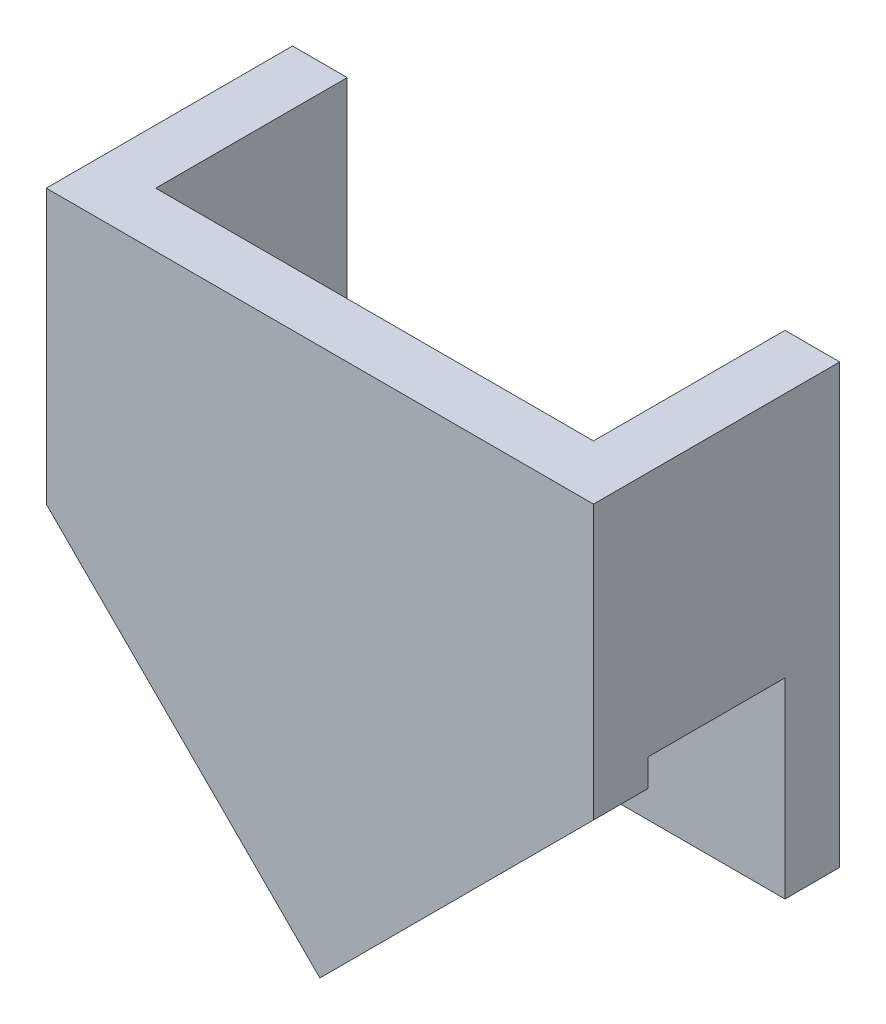
ISO-10303-21;
HEADER;
FILE_DESCRIPTION(('STEP AP214'),'2;1');
FILE_NAME('part.step','',(''),(''),'','','');
FILE_SCHEMA(('AUTOMOTIVE_DESIGN { 1 0 10303 214 1 1 1 1 }'));
ENDSEC;
DATA;
#1=APPLICATION_CONTEXT('core data for automotive mechanical design processes');
#2=APPLICATION_PROTOCOL_DEFINITION('international standard','automotive_design',2000,#1);
#3=PRODUCT_CONTEXT('',#1,'mechanical');
#4=PRODUCT('Part','Part','',(#3));
#5=PRODUCT_RELATED_PRODUCT_CATEGORY('part','',(#4));
#6=PRODUCT_DEFINITION_FORMATION('','',#4);
#7=PRODUCT_DEFINITION_CONTEXT('part definition',#1,'design');
#8=PRODUCT_DEFINITION('design','',#6,#7);
#9=PRODUCT_DEFINITION_SHAPE('','',#8);
#10=(LENGTH_UNIT() NAMED_UNIT(*) SI_UNIT(.MILLI.,.METRE.));
#11=(NAMED_UNIT(*) PLANE_ANGLE_UNIT() SI_UNIT($,.RADIAN.));
#12=(NAMED_UNIT(*) SI_UNIT($,.STERADIAN.) SOLID_ANGLE_UNIT());
#13=UNCERTAINTY_MEASURE_WITH_UNIT(LENGTH_MEASURE(1.E-05),#10,'distance_accuracy_value','');
#14=(GEOMETRIC_REPRESENTATION_CONTEXT(3) GLOBAL_UNCERTAINTY_ASSIGNED_CONTEXT((#13)) GLOBAL_UNIT_ASSIGNED_CONTEXT((#10,
#11,#12)) REPRESENTATION_CONTEXT('',''));
#15=CARTESIAN_POINT('',(0.,0.,0.));
#16=DIRECTION('',(0.,0.,1.));
#17=DIRECTION('',(1.,0.,0.));
#18=AXIS2_PLACEMENT_3D('',#15,#16,#17);
#19=CARTESIAN_POINT('',(40.,100.,12.5));
#20=DIRECTION('',(0.,0.,1.));
#21=DIRECTION('',(1.,0.,0.));
#22=AXIS2_PLACEMENT_3D('',#19,#20,#21);
#23=PLANE('',#22);
#24=DIRECTION('',(0.,-1.,0.));
#25=VECTOR('',#24,1.);
#26=CARTESIAN_POINT('',(40.,100.,12.5));
#27=LINE('',#26,#25);
#28=CARTESIAN_POINT('',(40.,100.,12.5));
#29=VERTEX_POINT('',#28);
#30=CARTESIAN_POINT('',(40.,65.,12.5));
#31=VERTEX_POINT('',#30);
#32=EDGE_CURVE('E277',#29,#31,#27,.T.);
#33=ORIENTED_EDGE('',*,*,#32,.T.);
#34=DIRECTION('',(1.,0.,0.));
#35=VECTOR('',#34,1.);
#36=CARTESIAN_POINT('',(-50.,65.,12.5));
#37=LINE('',#36,#35);
#38=CARTESIAN_POINT('',(-40.,65.,12.5));
#39=VERTEX_POINT('',#38);
#40=EDGE_CURVE('E220',#39,#31,#37,.T.);
#41=ORIENTED_EDGE('',*,*,#40,.F.);
#42=DIRECTION('',(0.,-1.,0.));
#43=VECTOR('',#42,1.);
#44=CARTESIAN_POINT('',(-40.,100.,12.5));
#45=LINE('',#44,#43);
#46=CARTESIAN_POINT('',(-40.,100.,12.5));
#47=VERTEX_POINT('',#46);
#48=EDGE_CURVE('E274',#47,#39,#45,.T.);
#49=ORIENTED_EDGE('',*,*,#48,.F.);
#50=DIRECTION('',(-1.,0.,0.));
#51=VECTOR('',#50,1.);
#52=CARTESIAN_POINT('',(40.,100.,12.5));
#53=LINE('',#52,#51);
#54=EDGE_CURVE('E268',#29,#47,#53,.T.);
#55=ORIENTED_EDGE('',*,*,#54,.F.);
#56=EDGE_LOOP('',(#33,#41,#49,#55));
#57=FACE_BOUND('',#56,.T.);
#58=ADVANCED_FACE('F38',(#57),#23,.F.);
#59=CARTESIAN_POINT('',(-50.,100.,22.5));
#60=DIRECTION('',(1.,0.,0.));
#61=DIRECTION('',(0.,0.,-1.));
#62=AXIS2_PLACEMENT_3D('',#59,#60,#61);
#63=PLANE('',#62);
#64=DIRECTION('',(0.,-1.,0.));
#65=VECTOR('',#64,1.);
#66=CARTESIAN_POINT('',(-50.,100.,22.5));
#67=LINE('',#66,#65);
#68=CARTESIAN_POINT('',(-50.,100.,22.5));
#69=VERTEX_POINT('',#68);
#70=CARTESIAN_POINT('',(-50.,50.,22.5));
#71=VERTEX_POINT('',#70);
#72=EDGE_CURVE('E289',#69,#71,#67,.T.);
#73=ORIENTED_EDGE('',*,*,#72,.F.);
#74=DIRECTION('',(0.,0.,1.));
#75=VECTOR('',#74,1.);
#76=CARTESIAN_POINT('',(-50.,100.,22.5));
#77=LINE('',#76,#75);
#78=CARTESIAN_POINT('',(-50.,100.,-22.5));
#79=VERTEX_POINT('',#78);
#80=EDGE_CURVE('E258',#79,#69,#77,.T.);
#81=ORIENTED_EDGE('',*,*,#80,.F.);
#82=DIRECTION('',(0.,-1.,0.));
#83=VECTOR('',#82,1.);
#84=CARTESIAN_POINT('',(-50.,100.,-22.5));
#85=LINE('',#84,#83);
#86=CARTESIAN_POINT('',(-50.,20.,-22.5000000000001));
#87=VERTEX_POINT('',#86);
#88=EDGE_CURVE('E46',#79,#87,#85,.T.);
#89=ORIENTED_EDGE('',*,*,#88,.T.);
#90=DIRECTION('',(0.,0.,-1.));
#91=VECTOR('',#90,1.);
#92=CARTESIAN_POINT('',(-50.,20.,-12.5000000000001));
#93=LINE('',#92,#91);
#94=CARTESIAN_POINT('',(-50.,20.,-12.5000000000001));
#95=VERTEX_POINT('',#94);
#96=EDGE_CURVE('E229',#95,#87,#93,.T.);
#97=ORIENTED_EDGE('',*,*,#96,.F.);
#98=DIRECTION('',(0.,1.,0.));
#99=VECTOR('',#98,1.);
#100=CARTESIAN_POINT('',(-50.,100.,-12.5));
#101=LINE('',#100,#99);
#102=CARTESIAN_POINT('',(-50.,55.,-12.5));
#103=VERTEX_POINT('',#102);
#104=EDGE_CURVE('E254',#95,#103,#101,.T.);
#105=ORIENTED_EDGE('',*,*,#104,.T.);
#106=DIRECTION('',(0.,0.,-1.));
#107=VECTOR('',#106,1.);
#108=CARTESIAN_POINT('',(-50.,55.,12.5));
#109=LINE('',#108,#107);
#110=CARTESIAN_POINT('',(-50.,55.,12.5));
#111=VERTEX_POINT('',#110);
#112=EDGE_CURVE('E204',#111,#103,#109,.T.);
#113=ORIENTED_EDGE('',*,*,#112,.F.);
#114=DIRECTION('',(0.,-1.,0.));
#115=VECTOR('',#114,1.);
#116=CARTESIAN_POINT('',(-50.,100.,12.5));
#117=LINE('',#116,#115);
#118=CARTESIAN_POINT('',(-50.,50.,12.5));
#119=VERTEX_POINT('',#118);
#120=EDGE_CURVE('E177',#111,#119,#117,.T.);
#121=ORIENTED_EDGE('',*,*,#120,.T.);
#122=DIRECTION('',(0.,0.,1.));
#123=VECTOR('',#122,1.);
#124=CARTESIAN_POINT('',(-50.,50.,12.5));
#125=LINE('',#124,#123);
#126=EDGE_CURVE('E248',#119,#71,#125,.T.);
#127=ORIENTED_EDGE('',*,*,#126,.T.);
#128=EDGE_LOOP('',(#73,#81,#89,#97,#105,#113,#121,#127));
#129=FACE_BOUND('',#128,.T.);
#130=ADVANCED_FACE('F40',(#129),#63,.F.);
#131=CARTESIAN_POINT('',(50.,100.,22.5));
#132=DIRECTION('',(0.,0.,-1.));
#133=DIRECTION('',(-1.,0.,0.));
#134=AXIS2_PLACEMENT_3D('',#131,#132,#133);
#135=PLANE('',#134);
#136=DIRECTION('',(-0.707106781186547,0.707106781186547,0.));
#137=VECTOR('',#136,1.);
#138=CARTESIAN_POINT('',(-50.,50.,22.5));
#139=LINE('',#138,#137);
#140=CARTESIAN_POINT('',(0.,0.,22.5));
#141=VERTEX_POINT('',#140);
#142=EDGE_CURVE('E242',#141,#71,#139,.T.);
#143=ORIENTED_EDGE('',*,*,#142,.F.);
#144=DIRECTION('',(-0.707106781186547,-0.707106781186548,0.));
#145=VECTOR('',#144,1.);
#146=CARTESIAN_POINT('',(0.,0.,22.5));
#147=LINE('',#146,#145);
#148=CARTESIAN_POINT('',(50.,50.,22.5));
#149=VERTEX_POINT('',#148);
#150=EDGE_CURVE('E233',#149,#141,#147,.T.);
#151=ORIENTED_EDGE('',*,*,#150,.F.);
#152=DIRECTION('',(0.,-1.,0.));
#153=VECTOR('',#152,1.);
#154=CARTESIAN_POINT('',(50.,100.,22.5));
#155=LINE('',#154,#153);
#156=CARTESIAN_POINT('',(50.,100.,22.5));
#157=VERTEX_POINT('',#156);
#158=EDGE_CURVE('E286',#157,#149,#155,.T.);
#159=ORIENTED_EDGE('',*,*,#158,.F.);
#160=DIRECTION('',(1.,0.,0.));
#161=VECTOR('',#160,1.);
#162=CARTESIAN_POINT('',(50.,100.,22.5));
#163=LINE('',#162,#161);
#164=EDGE_CURVE('E260',#69,#157,#163,.T.);
#165=ORIENTED_EDGE('',*,*,#164,.F.);
#166=ORIENTED_EDGE('',*,*,#72,.T.);
#167=EDGE_LOOP('',(#143,#151,#159,#165,#166));
#168=FACE_BOUND('',#167,.T.);
#169=ADVANCED_FACE('F316',(#168),#135,.F.);
#170=CARTESIAN_POINT('',(50.,100.,22.5));
#171=DIRECTION('',(-1.,0.,0.));
#172=DIRECTION('',(0.,0.,1.));
#173=AXIS2_PLACEMENT_3D('',#170,#171,#172);
#174=PLANE('',#173);
#175=DIRECTION('',(0.,0.,1.));
#176=VECTOR('',#175,1.);
#177=CARTESIAN_POINT('',(50.,50.,12.5));
#178=LINE('',#177,#176);
#179=CARTESIAN_POINT('',(50.,50.,12.5));
#180=VERTEX_POINT('',#179);
#181=EDGE_CURVE('E239',#180,#149,#178,.T.);
#182=ORIENTED_EDGE('',*,*,#181,.F.);
#183=DIRECTION('',(0.,1.,0.));
#184=VECTOR('',#183,1.);
#185=CARTESIAN_POINT('',(50.,100.,12.5));
#186=LINE('',#185,#184);
#187=CARTESIAN_POINT('',(50.,55.,12.5));
#188=VERTEX_POINT('',#187);
#189=EDGE_CURVE('E214',#180,#188,#186,.T.);
#190=ORIENTED_EDGE('',*,*,#189,.T.);
#191=DIRECTION('',(0.,0.,-1.));
#192=VECTOR('',#191,1.);
#193=CARTESIAN_POINT('',(50.,55.,12.5));
#194=LINE('',#193,#192);
#195=CARTESIAN_POINT('',(50.,55.,-12.5));
#196=VERTEX_POINT('',#195);
#197=EDGE_CURVE('E207',#188,#196,#194,.T.);
#198=ORIENTED_EDGE('',*,*,#197,.T.);
#199=DIRECTION('',(0.,-1.,0.));
#200=VECTOR('',#199,1.);
#201=CARTESIAN_POINT('',(50.,100.,-12.5));
#202=LINE('',#201,#200);
#203=CARTESIAN_POINT('',(50.,20.,-12.5));
#204=VERTEX_POINT('',#203);
#205=EDGE_CURVE('E53',#196,#204,#202,.T.);
#206=ORIENTED_EDGE('',*,*,#205,.T.);
#207=DIRECTION('',(0.,0.,-1.));
#208=VECTOR('',#207,1.);
#209=CARTESIAN_POINT('',(50.,20.,-12.5));
#210=LINE('',#209,#208);
#211=CARTESIAN_POINT('',(50.,20.,-22.5));
#212=VERTEX_POINT('',#211);
#213=EDGE_CURVE('E231',#204,#212,#210,.T.);
#214=ORIENTED_EDGE('',*,*,#213,.T.);
#215=DIRECTION('',(0.,-1.,0.));
#216=VECTOR('',#215,1.);
#217=CARTESIAN_POINT('',(50.,100.,-22.5));
#218=LINE('',#217,#216);
#219=CARTESIAN_POINT('',(50.,100.,-22.5));
#220=VERTEX_POINT('',#219);
#221=EDGE_CURVE('E283',#220,#212,#218,.T.);
#222=ORIENTED_EDGE('',*,*,#221,.F.);
#223=DIRECTION('',(0.,0.,-1.));
#224=VECTOR('',#223,1.);
#225=CARTESIAN_POINT('',(50.,100.,22.5));
#226=LINE('',#225,#224);
#227=EDGE_CURVE('E262',#157,#220,#226,.T.);
#228=ORIENTED_EDGE('',*,*,#227,.F.);
#229=ORIENTED_EDGE('',*,*,#158,.T.);
#230=EDGE_LOOP('',(#182,#190,#198,#206,#214,#222,#228,#229));
#231=FACE_BOUND('',#230,.T.);
#232=ADVANCED_FACE('F323',(#231),#174,.F.);
#233=CARTESIAN_POINT('',(50.,100.,-22.5));
#234=DIRECTION('',(0.,0.,1.));
#235=DIRECTION('',(1.,0.,0.));
#236=AXIS2_PLACEMENT_3D('',#233,#234,#235);
#237=PLANE('',#236);
#238=ORIENTED_EDGE('',*,*,#221,.T.);
#239=DIRECTION('',(1.,0.,0.));
#240=VECTOR('',#239,1.);
#241=CARTESIAN_POINT('',(-50.,20.,-22.5000000000001));
#242=LINE('',#241,#240);
#243=EDGE_CURVE('E225',#87,#212,#242,.T.);
#244=ORIENTED_EDGE('',*,*,#243,.F.);
#245=ORIENTED_EDGE('',*,*,#88,.F.);
#246=DIRECTION('',(-1.,0.,0.));
#247=VECTOR('',#246,1.);
#248=CARTESIAN_POINT('',(-40.,100.,-22.5));
#249=LINE('',#248,#247);
#250=CARTESIAN_POINT('',(-40.,100.,-22.5));
#251=VERTEX_POINT('',#250);
#252=EDGE_CURVE('E256',#251,#79,#249,.T.);
#253=ORIENTED_EDGE('',*,*,#252,.F.);
#254=DIRECTION('',(0.,-1.,0.));
#255=VECTOR('',#254,1.);
#256=CARTESIAN_POINT('',(-40.,100.,-22.5));
#257=LINE('',#256,#255);
#258=CARTESIAN_POINT('',(-40.,65.,-22.5000000000001));
#259=VERTEX_POINT('',#258);
#260=EDGE_CURVE('E271',#251,#259,#257,.T.);
#261=ORIENTED_EDGE('',*,*,#260,.T.);
#262=DIRECTION('',(1.,0.,0.));
#263=VECTOR('',#262,1.);
#264=CARTESIAN_POINT('',(40.,65.,-22.5));
#265=LINE('',#264,#263);
#266=CARTESIAN_POINT('',(40.,65.,-22.5));
#267=VERTEX_POINT('',#266);
#268=EDGE_CURVE('E217',#259,#267,#265,.T.);
#269=ORIENTED_EDGE('',*,*,#268,.T.);
#270=DIRECTION('',(0.,-1.,0.));
#271=VECTOR('',#270,1.);
#272=CARTESIAN_POINT('',(40.,100.,-22.5));
#273=LINE('',#272,#271);
#274=CARTESIAN_POINT('',(40.,100.,-22.5));
#275=VERTEX_POINT('',#274);
#276=EDGE_CURVE('E280',#275,#267,#273,.T.);
#277=ORIENTED_EDGE('',*,*,#276,.F.);
#278=DIRECTION('',(-1.,0.,0.));
#279=VECTOR('',#278,1.);
#280=CARTESIAN_POINT('',(50.,100.,-22.5));
#281=LINE('',#280,#279);
#282=EDGE_CURVE('E264',#220,#275,#281,.T.);
#283=ORIENTED_EDGE('',*,*,#282,.F.);
#284=EDGE_LOOP('',(#238,#244,#245,#253,#261,#269,#277,#283));
#285=FACE_BOUND('',#284,.T.);
#286=ADVANCED_FACE('F298',(#285),#237,.F.);
#287=CARTESIAN_POINT('',(40.,100.,-22.5));
#288=DIRECTION('',(1.,0.,0.));
#289=DIRECTION('',(0.,0.,-1.));
#290=AXIS2_PLACEMENT_3D('',#287,#288,#289);
#291=PLANE('',#290);
#292=ORIENTED_EDGE('',*,*,#32,.F.);
#293=DIRECTION('',(0.,0.,1.));
#294=VECTOR('',#293,1.);
#295=CARTESIAN_POINT('',(40.,100.,-22.5));
#296=LINE('',#295,#294);
#297=EDGE_CURVE('E266',#275,#29,#296,.T.);
#298=ORIENTED_EDGE('',*,*,#297,.F.);
#299=ORIENTED_EDGE('',*,*,#276,.T.);
#300=DIRECTION('',(0.,0.,1.));
#301=VECTOR('',#300,1.);
#302=CARTESIAN_POINT('',(40.,65.,-22.5));
#303=LINE('',#302,#301);
#304=EDGE_CURVE('E223',#267,#31,#303,.T.);
#305=ORIENTED_EDGE('',*,*,#304,.T.);
#306=EDGE_LOOP('',(#292,#298,#299,#305));
#307=FACE_BOUND('',#306,.T.);
#308=ADVANCED_FACE('F328',(#307),#291,.F.);
#309=DIRECTION('',(-0.707106781186547,0.707106781186547,0.));
#310=VECTOR('',#309,1.);
#311=CARTESIAN_POINT('',(-50.,50.,12.5));
#312=LINE('',#311,#310);
#313=CARTESIAN_POINT('',(0.,0.,12.5));
#314=VERTEX_POINT('',#313);
#315=EDGE_CURVE('E243',#314,#119,#312,.T.);
#316=ORIENTED_EDGE('',*,*,#315,.T.);
#317=ORIENTED_EDGE('',*,*,#120,.F.);
#318=DIRECTION('',(1.,0.,0.));
#319=VECTOR('',#318,1.);
#320=CARTESIAN_POINT('',(-46.1602540378444,55.,12.5));
#321=LINE('',#320,#319);
#322=CARTESIAN_POINT('',(-46.1602540378444,55.,12.5));
#323=VERTEX_POINT('',#322);
#324=EDGE_CURVE('E200',#111,#323,#321,.T.);
#325=ORIENTED_EDGE('',*,*,#324,.T.);
#326=CARTESIAN_POINT('',(-37.5,60.,12.5));
#327=DIRECTION('',(0.,0.,1.));
#328=DIRECTION('',(1.,0.,0.));
#329=AXIS2_PLACEMENT_3D('',#326,#327,#328);
#330=CIRCLE('',#329,10.);
#331=CARTESIAN_POINT('',(-28.8397459621556,55.,12.5));
#332=VERTEX_POINT('',#331);
#333=EDGE_CURVE('E193',#323,#332,#330,.T.);
#334=ORIENTED_EDGE('',*,*,#333,.T.);
#335=DIRECTION('',(1.,0.,0.));
#336=VECTOR('',#335,1.);
#337=CARTESIAN_POINT('',(28.8397459621556,55.,12.5));
#338=LINE('',#337,#336);
#339=CARTESIAN_POINT('',(28.8397459621556,55.,12.5));
#340=VERTEX_POINT('',#339);
#341=EDGE_CURVE('E176',#332,#340,#338,.T.);
#342=ORIENTED_EDGE('',*,*,#341,.T.);
#343=CARTESIAN_POINT('',(37.5,60.,12.5));
#344=DIRECTION('',(0.,0.,1.));
#345=DIRECTION('',(1.,0.,0.));
#346=AXIS2_PLACEMENT_3D('',#343,#344,#345);
#347=CIRCLE('',#346,10.);
#348=CARTESIAN_POINT('',(46.1602540378444,55.,12.5));
#349=VERTEX_POINT('',#348);
#350=EDGE_CURVE('E196',#340,#349,#347,.T.);
#351=ORIENTED_EDGE('',*,*,#350,.T.);
#352=DIRECTION('',(1.,0.,0.));
#353=VECTOR('',#352,1.);
#354=CARTESIAN_POINT('',(50.,55.,12.5));
#355=LINE('',#354,#353);
#356=EDGE_CURVE('E198',#349,#188,#355,.T.);
#357=ORIENTED_EDGE('',*,*,#356,.T.);
#358=ORIENTED_EDGE('',*,*,#189,.F.);
#359=DIRECTION('',(-0.707106781186547,-0.707106781186548,0.));
#360=VECTOR('',#359,1.);
#361=CARTESIAN_POINT('',(0.,0.,12.5));
#362=LINE('',#361,#360);
#363=EDGE_CURVE('E236',#180,#314,#362,.T.);
#364=ORIENTED_EDGE('',*,*,#363,.T.);
#365=EDGE_LOOP('',(#316,#317,#325,#334,#342,#351,#357,#358,#364));
#366=FACE_BOUND('',#365,.T.);
#367=ADVANCED_FACE('F308',(#366),#23,.F.);
#368=CARTESIAN_POINT('',(-40.,100.,-22.5));
#369=DIRECTION('',(-1.,0.,0.));
#370=DIRECTION('',(0.,0.,1.));
#371=AXIS2_PLACEMENT_3D('',#368,#369,#370);
#372=PLANE('',#371);
#373=DIRECTION('',(0.,0.,-1.));
#374=VECTOR('',#373,1.);
#375=CARTESIAN_POINT('',(-40.,65.,-22.5));
#376=LINE('',#375,#374);
#377=EDGE_CURVE('E12',#39,#259,#376,.T.);
#378=ORIENTED_EDGE('',*,*,#377,.T.);
#379=ORIENTED_EDGE('',*,*,#260,.F.);
#380=DIRECTION('',(0.,0.,-1.));
#381=VECTOR('',#380,1.);
#382=CARTESIAN_POINT('',(-40.,100.,-22.5));
#383=LINE('',#382,#381);
#384=EDGE_CURVE('E61',#47,#251,#383,.T.);
#385=ORIENTED_EDGE('',*,*,#384,.F.);
#386=ORIENTED_EDGE('',*,*,#48,.T.);
#387=EDGE_LOOP('',(#378,#379,#385,#386));
#388=FACE_BOUND('',#387,.T.);
#389=ADVANCED_FACE('F334',(#388),#372,.F.);
#390=CARTESIAN_POINT('',(0.,100.,0.));
#391=DIRECTION('',(0.,-1.,0.));
#392=DIRECTION('',(0.,0.,-1.));
#393=AXIS2_PLACEMENT_3D('',#390,#391,#392);
#394=PLANE('',#393);
#395=ORIENTED_EDGE('',*,*,#227,.T.);
#396=ORIENTED_EDGE('',*,*,#282,.T.);
#397=ORIENTED_EDGE('',*,*,#297,.T.);
#398=ORIENTED_EDGE('',*,*,#54,.T.);
#399=ORIENTED_EDGE('',*,*,#384,.T.);
#400=ORIENTED_EDGE('',*,*,#252,.T.);
#401=ORIENTED_EDGE('',*,*,#80,.T.);
#402=ORIENTED_EDGE('',*,*,#164,.T.);
#403=EDGE_LOOP('',(#395,#396,#397,#398,#399,#400,#401,#402));
#404=FACE_BOUND('',#403,.T.);
#405=ADVANCED_FACE('F320',(#404),#394,.F.);
#406=CARTESIAN_POINT('',(100.,55.,-12.5));
#407=DIRECTION('',(0.,0.,-1.));
#408=DIRECTION('',(0.,1.,0.));
#409=AXIS2_PLACEMENT_3D('',#406,#407,#408);
#410=PLANE('',#409);
#411=ORIENTED_EDGE('',*,*,#104,.F.);
#412=DIRECTION('',(1.,0.,0.));
#413=VECTOR('',#412,1.);
#414=CARTESIAN_POINT('',(-50.,20.,-12.5000000000001));
#415=LINE('',#414,#413);
#416=EDGE_CURVE('E226',#95,#204,#415,.T.);
#417=ORIENTED_EDGE('',*,*,#416,.T.);
#418=ORIENTED_EDGE('',*,*,#205,.F.);
#419=DIRECTION('',(1.,0.,0.));
#420=VECTOR('',#419,1.);
#421=CARTESIAN_POINT('',(50.,55.,-12.5));
#422=LINE('',#421,#420);
#423=CARTESIAN_POINT('',(46.1602540378444,55.,-12.5));
#424=VERTEX_POINT('',#423);
#425=EDGE_CURVE('E186',#424,#196,#422,.T.);
#426=ORIENTED_EDGE('',*,*,#425,.F.);
#427=CARTESIAN_POINT('',(37.5,60.,-12.5));
#428=DIRECTION('',(0.,0.,1.));
#429=DIRECTION('',(1.,0.,0.));
#430=AXIS2_PLACEMENT_3D('',#427,#428,#429);
#431=CIRCLE('',#430,10.);
#432=CARTESIAN_POINT('',(28.8397459621556,55.,-12.5));
#433=VERTEX_POINT('',#432);
#434=EDGE_CURVE('E183',#433,#424,#431,.T.);
#435=ORIENTED_EDGE('',*,*,#434,.F.);
#436=DIRECTION('',(1.,0.,0.));
#437=VECTOR('',#436,1.);
#438=CARTESIAN_POINT('',(28.8397459621556,55.,-12.5));
#439=LINE('',#438,#437);
#440=CARTESIAN_POINT('',(-28.8397459621556,55.,-12.5));
#441=VERTEX_POINT('',#440);
#442=EDGE_CURVE('E169',#441,#433,#439,.T.);
#443=ORIENTED_EDGE('',*,*,#442,.F.);
#444=CARTESIAN_POINT('',(-37.5,60.,-12.5));
#445=DIRECTION('',(0.,0.,1.));
#446=DIRECTION('',(1.,0.,0.));
#447=AXIS2_PLACEMENT_3D('',#444,#445,#446);
#448=CIRCLE('',#447,10.);
#449=CARTESIAN_POINT('',(-46.1602540378444,55.,-12.5));
#450=VERTEX_POINT('',#449);
#451=EDGE_CURVE('E158',#450,#441,#448,.T.);
#452=ORIENTED_EDGE('',*,*,#451,.F.);
#453=DIRECTION('',(1.,0.,0.));
#454=VECTOR('',#453,1.);
#455=CARTESIAN_POINT('',(-46.1602540378444,55.,-12.5));
#456=LINE('',#455,#454);
#457=EDGE_CURVE('E191',#103,#450,#456,.T.);
#458=ORIENTED_EDGE('',*,*,#457,.F.);
#459=EDGE_LOOP('',(#411,#417,#418,#426,#435,#443,#452,#458));
#460=FACE_BOUND('',#459,.T.);
#461=ADVANCED_FACE('F181',(#460),#410,.F.);
#462=CARTESIAN_POINT('',(-50.,50.,12.5));
#463=DIRECTION('',(0.707106781186548,0.707106781186548,0.));
#464=DIRECTION('',(-0.707106781186548,0.707106781186548,0.));
#465=AXIS2_PLACEMENT_3D('',#462,#463,#464);
#466=PLANE('',#465);
#467=ORIENTED_EDGE('',*,*,#142,.T.);
#468=ORIENTED_EDGE('',*,*,#126,.F.);
#469=ORIENTED_EDGE('',*,*,#315,.F.);
#470=DIRECTION('',(0.,0.,1.));
#471=VECTOR('',#470,1.);
#472=CARTESIAN_POINT('',(0.,0.,12.5));
#473=LINE('',#472,#471);
#474=EDGE_CURVE('E246',#314,#141,#473,.T.);
#475=ORIENTED_EDGE('',*,*,#474,.T.);
#476=EDGE_LOOP('',(#467,#468,#469,#475));
#477=FACE_BOUND('',#476,.T.);
#478=ADVANCED_FACE('F312',(#477),#466,.F.);
#479=CARTESIAN_POINT('',(0.,0.,12.5));
#480=DIRECTION('',(-0.707106781186548,0.707106781186547,0.));
#481=DIRECTION('',(-0.707106781186547,-0.707106781186548,0.));
#482=AXIS2_PLACEMENT_3D('',#479,#480,#481);
#483=PLANE('',#482);
#484=ORIENTED_EDGE('',*,*,#150,.T.);
#485=ORIENTED_EDGE('',*,*,#474,.F.);
#486=ORIENTED_EDGE('',*,*,#363,.F.);
#487=ORIENTED_EDGE('',*,*,#181,.T.);
#488=EDGE_LOOP('',(#484,#485,#486,#487));
#489=FACE_BOUND('',#488,.T.);
#490=ADVANCED_FACE('F345',(#489),#483,.F.);
#491=CARTESIAN_POINT('',(-50.,20.,-12.5000000000001));
#492=DIRECTION('',(0.,1.,0.));
#493=DIRECTION('',(-1.,0.,0.));
#494=AXIS2_PLACEMENT_3D('',#491,#492,#493);
#495=PLANE('',#494);
#496=ORIENTED_EDGE('',*,*,#243,.T.);
#497=ORIENTED_EDGE('',*,*,#213,.F.);
#498=ORIENTED_EDGE('',*,*,#416,.F.);
#499=ORIENTED_EDGE('',*,*,#96,.T.);
#500=EDGE_LOOP('',(#496,#497,#498,#499));
#501=FACE_BOUND('',#500,.T.);
#502=ADVANCED_FACE('F302',(#501),#495,.F.);
#503=CARTESIAN_POINT('',(-50.,65.,12.5));
#504=DIRECTION('',(0.,1.,0.));
#505=DIRECTION('',(0.,0.,1.));
#506=AXIS2_PLACEMENT_3D('',#503,#504,#505);
#507=PLANE('',#506);
#508=ORIENTED_EDGE('',*,*,#40,.T.);
#509=ORIENTED_EDGE('',*,*,#304,.F.);
#510=ORIENTED_EDGE('',*,*,#268,.F.);
#511=ORIENTED_EDGE('',*,*,#377,.F.);
#512=EDGE_LOOP('',(#508,#509,#510,#511));
#513=FACE_BOUND('',#512,.T.);
#514=ADVANCED_FACE('F336',(#513),#507,.T.);
#515=CARTESIAN_POINT('',(-37.5,60.,12.5));
#516=DIRECTION('',(0.,0.,-1.));
#517=DIRECTION('',(-1.,0.,0.));
#518=AXIS2_PLACEMENT_3D('',#515,#516,#517);
#519=CYLINDRICAL_SURFACE('',#518,10.);
#520=ORIENTED_EDGE('',*,*,#451,.T.);
#521=DIRECTION('',(0.,0.,-1.));
#522=VECTOR('',#521,1.);
#523=CARTESIAN_POINT('',(-28.8397459621556,55.,12.5));
#524=LINE('',#523,#522);
#525=EDGE_CURVE('E161',#332,#441,#524,.T.);
#526=ORIENTED_EDGE('',*,*,#525,.F.);
#527=ORIENTED_EDGE('',*,*,#333,.F.);
#528=DIRECTION('',(0.,0.,-1.));
#529=VECTOR('',#528,1.);
#530=CARTESIAN_POINT('',(-46.1602540378444,55.,12.5));
#531=LINE('',#530,#529);
#532=EDGE_CURVE('E164',#323,#450,#531,.T.);
#533=ORIENTED_EDGE('',*,*,#532,.T.);
#534=EDGE_LOOP('',(#520,#526,#527,#533));
#535=FACE_BOUND('',#534,.T.);
#536=ADVANCED_FACE('F160',(#535),#519,.T.);
#537=CARTESIAN_POINT('',(37.5,60.,12.5));
#538=DIRECTION('',(0.,0.,-1.));
#539=DIRECTION('',(-1.,0.,0.));
#540=AXIS2_PLACEMENT_3D('',#537,#538,#539);
#541=CYLINDRICAL_SURFACE('',#540,10.);
#542=ORIENTED_EDGE('',*,*,#434,.T.);
#543=DIRECTION('',(0.,0.,-1.));
#544=VECTOR('',#543,1.);
#545=CARTESIAN_POINT('',(46.1602540378444,55.,12.5));
#546=LINE('',#545,#544);
#547=EDGE_CURVE('E209',#349,#424,#546,.T.);
#548=ORIENTED_EDGE('',*,*,#547,.F.);
#549=ORIENTED_EDGE('',*,*,#350,.F.);
#550=DIRECTION('',(0.,0.,-1.));
#551=VECTOR('',#550,1.);
#552=CARTESIAN_POINT('',(28.8397459621556,55.,12.5));
#553=LINE('',#552,#551);
#554=EDGE_CURVE('E178',#340,#433,#553,.T.);
#555=ORIENTED_EDGE('',*,*,#554,.T.);
#556=EDGE_LOOP('',(#542,#548,#549,#555));
#557=FACE_BOUND('',#556,.T.);
#558=ADVANCED_FACE('F343',(#557),#541,.T.);
#559=CARTESIAN_POINT('',(28.8397459621556,55.,12.5));
#560=DIRECTION('',(0.,1.,0.));
#561=DIRECTION('',(-1.,0.,0.));
#562=AXIS2_PLACEMENT_3D('',#559,#560,#561);
#563=PLANE('',#562);
#564=ORIENTED_EDGE('',*,*,#554,.F.);
#565=ORIENTED_EDGE('',*,*,#341,.F.);
#566=ORIENTED_EDGE('',*,*,#525,.T.);
#567=ORIENTED_EDGE('',*,*,#442,.T.);
#568=EDGE_LOOP('',(#564,#565,#566,#567));
#569=FACE_BOUND('',#568,.T.);
#570=ADVANCED_FACE('F174',(#569),#563,.F.);
#571=CARTESIAN_POINT('',(50.,55.,12.5));
#572=DIRECTION('',(0.,1.,0.));
#573=DIRECTION('',(0.,0.,1.));
#574=AXIS2_PLACEMENT_3D('',#571,#572,#573);
#575=PLANE('',#574);
#576=ORIENTED_EDGE('',*,*,#197,.F.);
#577=ORIENTED_EDGE('',*,*,#356,.F.);
#578=ORIENTED_EDGE('',*,*,#547,.T.);
#579=ORIENTED_EDGE('',*,*,#425,.T.);
#580=EDGE_LOOP('',(#576,#577,#578,#579));
#581=FACE_BOUND('',#580,.T.);
#582=ADVANCED_FACE('F466',(#581),#575,.F.);
#583=CARTESIAN_POINT('',(-46.1602540378444,55.,12.5));
#584=DIRECTION('',(0.,1.,0.));
#585=DIRECTION('',(0.,0.,1.));
#586=AXIS2_PLACEMENT_3D('',#583,#584,#585);
#587=PLANE('',#586);
#588=ORIENTED_EDGE('',*,*,#532,.F.);
#589=ORIENTED_EDGE('',*,*,#324,.F.);
#590=ORIENTED_EDGE('',*,*,#112,.T.);
#591=ORIENTED_EDGE('',*,*,#457,.T.);
#592=EDGE_LOOP('',(#588,#589,#590,#591));
#593=FACE_BOUND('',#592,.T.);
#594=ADVANCED_FACE('F306',(#593),#587,.F.);
#595=CLOSED_SHELL('',(#58,#130,#169,#232,#286,#308,#367,#389,#405,#461,#478,#490,#502,#514,#536,
#558,#570,#582,#594));
#596=MANIFOLD_SOLID_BREP('B2',#595);
#597=ADVANCED_BREP_SHAPE_REPRESENTATION('',(#18,#596),#14);
#598=SHAPE_DEFINITION_REPRESENTATION(#9,#597);
ENDSEC;
END-ISO-10303-21;
